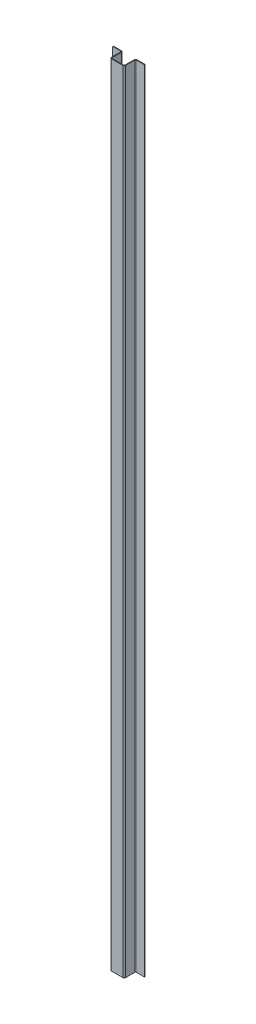
ISO-10303-21;
HEADER;
FILE_DESCRIPTION(('STEP AP214'),'2;1');
FILE_NAME('part.step','',(''),(''),'','','');
FILE_SCHEMA(('AUTOMOTIVE_DESIGN { 1 0 10303 214 1 1 1 1 }'));
ENDSEC;
DATA;
#1=APPLICATION_CONTEXT('core data for automotive mechanical design processes');
#2=APPLICATION_PROTOCOL_DEFINITION('international standard','automotive_design',2000,#1);
#3=PRODUCT_CONTEXT('',#1,'mechanical');
#4=PRODUCT('Part','Part','',(#3));
#5=PRODUCT_RELATED_PRODUCT_CATEGORY('part','',(#4));
#6=PRODUCT_DEFINITION_FORMATION('','',#4);
#7=PRODUCT_DEFINITION_CONTEXT('part definition',#1,'design');
#8=PRODUCT_DEFINITION('design','',#6,#7);
#9=PRODUCT_DEFINITION_SHAPE('','',#8);
#10=(LENGTH_UNIT() NAMED_UNIT(*) SI_UNIT(.MILLI.,.METRE.));
#11=(NAMED_UNIT(*) PLANE_ANGLE_UNIT() SI_UNIT($,.RADIAN.));
#12=(NAMED_UNIT(*) SI_UNIT($,.STERADIAN.) SOLID_ANGLE_UNIT());
#13=UNCERTAINTY_MEASURE_WITH_UNIT(LENGTH_MEASURE(1.E-05),#10,'distance_accuracy_value','');
#14=(GEOMETRIC_REPRESENTATION_CONTEXT(3) GLOBAL_UNCERTAINTY_ASSIGNED_CONTEXT((#13)) GLOBAL_UNIT_ASSIGNED_CONTEXT((#10,
#11,#12)) REPRESENTATION_CONTEXT('',''));
#15=CARTESIAN_POINT('',(0.,0.,0.));
#16=DIRECTION('',(0.,0.,1.));
#17=DIRECTION('',(1.,0.,0.));
#18=AXIS2_PLACEMENT_3D('',#15,#16,#17);
#19=CARTESIAN_POINT('',(22.5000000000011,-1254.,-38.0000000000003));
#20=DIRECTION('',(0.,1.,0.));
#21=DIRECTION('',(0.,0.,1.));
#22=AXIS2_PLACEMENT_3D('',#19,#20,#21);
#23=PLANE('',#22);
#24=DIRECTION('',(-1.,0.,0.));
#25=VECTOR('',#24,1.);
#26=CARTESIAN_POINT('',(22.4999999999993,-1254.,-33.4999999999996));
#27=LINE('',#26,#25);
#28=CARTESIAN_POINT('',(22.4999999999993,-1254.,-33.4999999999996));
#29=VERTEX_POINT('',#28);
#30=CARTESIAN_POINT('',(20.499999999999,-1254.,-33.4999999999996));
#31=VERTEX_POINT('',#30);
#32=EDGE_CURVE('E314',#29,#31,#27,.T.);
#33=ORIENTED_EDGE('',*,*,#32,.F.);
#34=DIRECTION('',(0.,0.,-1.));
#35=VECTOR('',#34,1.);
#36=CARTESIAN_POINT('',(22.5000000000001,-1254.,7.54951656745106E-12));
#37=LINE('',#36,#35);
#38=CARTESIAN_POINT('',(22.5000000000001,-1254.,-4.49999999999973));
#39=VERTEX_POINT('',#38);
#40=EDGE_CURVE('E416',#39,#29,#37,.T.);
#41=ORIENTED_EDGE('',*,*,#40,.F.);
#42=DIRECTION('',(-1.,0.,0.));
#43=VECTOR('',#42,1.);
#44=CARTESIAN_POINT('',(20.5000000000001,-1254.,-4.49999999999973));
#45=LINE('',#44,#43);
#46=CARTESIAN_POINT('',(20.5000000000001,-1254.,-4.49999999999973));
#47=VERTEX_POINT('',#46);
#48=EDGE_CURVE('E427',#47,#39,#45,.F.);
#49=ORIENTED_EDGE('',*,*,#48,.F.);
#50=DIRECTION('',(0.,0.,1.));
#51=VECTOR('',#50,1.);
#52=CARTESIAN_POINT('',(20.5000000000009,-1254.,-38.0000000000003));
#53=LINE('',#52,#51);
#54=EDGE_CURVE('E421',#47,#31,#53,.F.);
#55=ORIENTED_EDGE('',*,*,#54,.T.);
#56=EDGE_LOOP('',(#33,#41,#49,#55));
#57=FACE_BOUND('',#56,.T.);
#58=ADVANCED_FACE('F118',(#57),#23,.F.);
#59=CARTESIAN_POINT('',(22.5000000000001,1254.,-1.99999999999978));
#60=DIRECTION('',(0.,-1.,0.));
#61=DIRECTION('',(0.,0.,-1.));
#62=AXIS2_PLACEMENT_3D('',#59,#60,#61);
#63=PLANE('',#62);
#64=DIRECTION('',(-1.,0.,0.));
#65=VECTOR('',#64,1.);
#66=CARTESIAN_POINT('',(22.4999999999996,1254.,-33.4999999999996));
#67=LINE('',#66,#65);
#68=CARTESIAN_POINT('',(22.4999999999996,1254.,-33.4999999999996));
#69=VERTEX_POINT('',#68);
#70=CARTESIAN_POINT('',(20.5,1254.,-33.5000000000005));
#71=VERTEX_POINT('',#70);
#72=EDGE_CURVE('E303',#69,#71,#67,.T.);
#73=ORIENTED_EDGE('',*,*,#72,.T.);
#74=DIRECTION('',(0.,0.,-1.));
#75=VECTOR('',#74,1.);
#76=CARTESIAN_POINT('',(20.5000000000006,1254.,-1.99999999999978));
#77=LINE('',#76,#75);
#78=CARTESIAN_POINT('',(20.5000000000006,1254.,-4.49999999999928));
#79=VERTEX_POINT('',#78);
#80=EDGE_CURVE('E419',#71,#79,#77,.F.);
#81=ORIENTED_EDGE('',*,*,#80,.T.);
#82=DIRECTION('',(-1.,0.,0.));
#83=VECTOR('',#82,1.);
#84=CARTESIAN_POINT('',(22.5000000000001,1254.,-4.49999999999973));
#85=LINE('',#84,#83);
#86=CARTESIAN_POINT('',(22.5000000000001,1254.,-4.49999999999973));
#87=VERTEX_POINT('',#86);
#88=EDGE_CURVE('E410',#79,#87,#85,.F.);
#89=ORIENTED_EDGE('',*,*,#88,.T.);
#90=DIRECTION('',(0.,0.,1.));
#91=VECTOR('',#90,1.);
#92=CARTESIAN_POINT('',(22.5,1254.,-7.54951656745106E-12));
#93=LINE('',#92,#91);
#94=EDGE_CURVE('E413',#69,#87,#93,.T.);
#95=ORIENTED_EDGE('',*,*,#94,.F.);
#96=EDGE_LOOP('',(#73,#81,#89,#95));
#97=FACE_BOUND('',#96,.T.);
#98=ADVANCED_FACE('F512',(#97),#63,.F.);
#99=CARTESIAN_POINT('',(22.4999999999996,-3.33066907387547E-13,4.44089209850063E-13));
#100=DIRECTION('',(-1.,0.,0.));
#101=DIRECTION('',(0.,0.,1.));
#102=AXIS2_PLACEMENT_3D('',#99,#100,#101);
#103=PLANE('',#102);
#104=DIRECTION('',(0.,1.,0.));
#105=VECTOR('',#104,1.);
#106=CARTESIAN_POINT('',(22.4999999999996,1254.,-33.4999999999996));
#107=LINE('',#106,#105);
#108=EDGE_CURVE('E309',#69,#29,#107,.F.);
#109=ORIENTED_EDGE('',*,*,#108,.F.);
#110=ORIENTED_EDGE('',*,*,#94,.T.);
#111=DIRECTION('',(0.,-1.,0.));
#112=VECTOR('',#111,1.);
#113=CARTESIAN_POINT('',(22.5000000000001,1254.,-4.49999999999973));
#114=LINE('',#113,#112);
#115=EDGE_CURVE('E424',#39,#87,#114,.F.);
#116=ORIENTED_EDGE('',*,*,#115,.F.);
#117=ORIENTED_EDGE('',*,*,#40,.T.);
#118=EDGE_LOOP('',(#109,#110,#116,#117));
#119=FACE_BOUND('',#118,.T.);
#120=ADVANCED_FACE('F518',(#119),#103,.F.);
#121=CARTESIAN_POINT('',(20.4999999999999,-4.16333634234434E-13,-4.44089209850063E-13));
#122=DIRECTION('',(-1.,0.,0.));
#123=DIRECTION('',(0.,0.,1.));
#124=AXIS2_PLACEMENT_3D('',#121,#122,#123);
#125=PLANE('',#124);
#126=ORIENTED_EDGE('',*,*,#80,.F.);
#127=DIRECTION('',(0.,1.,0.));
#128=VECTOR('',#127,1.);
#129=CARTESIAN_POINT('',(20.5,1254.,-33.5000000000005));
#130=LINE('',#129,#128);
#131=EDGE_CURVE('E298',#71,#31,#130,.F.);
#132=ORIENTED_EDGE('',*,*,#131,.T.);
#133=ORIENTED_EDGE('',*,*,#54,.F.);
#134=DIRECTION('',(0.,-1.,0.));
#135=VECTOR('',#134,1.);
#136=CARTESIAN_POINT('',(20.5000000000006,1254.,-4.49999999999928));
#137=LINE('',#136,#135);
#138=EDGE_CURVE('E430',#79,#47,#137,.T.);
#139=ORIENTED_EDGE('',*,*,#138,.F.);
#140=EDGE_LOOP('',(#126,#132,#133,#139));
#141=FACE_BOUND('',#140,.T.);
#142=ADVANCED_FACE('F819',(#141),#125,.T.);
#143=CARTESIAN_POINT('',(-22.4999999999987,1254.,-37.9999999999985));
#144=DIRECTION('',(0.,-1.,0.));
#145=DIRECTION('',(0.,0.,-1.));
#146=AXIS2_PLACEMENT_3D('',#143,#144,#145);
#147=PLANE('',#146);
#148=DIRECTION('',(1.,0.,0.));
#149=VECTOR('',#148,1.);
#150=CARTESIAN_POINT('',(-22.5000000000006,1254.,-33.4999999999979));
#151=LINE('',#150,#149);
#152=CARTESIAN_POINT('',(-22.5000000000006,1254.,-33.4999999999979));
#153=VERTEX_POINT('',#152);
#154=CARTESIAN_POINT('',(-20.5000000000006,1254.,-33.4999999999974));
#155=VERTEX_POINT('',#154);
#156=EDGE_CURVE('E364',#153,#155,#151,.T.);
#157=ORIENTED_EDGE('',*,*,#156,.F.);
#158=DIRECTION('',(0.,0.,-1.));
#159=VECTOR('',#158,1.);
#160=CARTESIAN_POINT('',(-22.4999999999999,1254.,-5.77315972805081E-12));
#161=LINE('',#160,#159);
#162=CARTESIAN_POINT('',(-22.5000000000001,1254.,-4.49999999999839));
#163=VERTEX_POINT('',#162);
#164=EDGE_CURVE('E372',#163,#153,#161,.T.);
#165=ORIENTED_EDGE('',*,*,#164,.F.);
#166=DIRECTION('',(1.,0.,0.));
#167=VECTOR('',#166,1.);
#168=CARTESIAN_POINT('',(-20.5000000000006,1254.,-4.49999999999751));
#169=LINE('',#168,#167);
#170=CARTESIAN_POINT('',(-20.5000000000006,1254.,-4.49999999999751));
#171=VERTEX_POINT('',#170);
#172=EDGE_CURVE('E383',#171,#163,#169,.F.);
#173=ORIENTED_EDGE('',*,*,#172,.F.);
#174=DIRECTION('',(0.,0.,1.));
#175=VECTOR('',#174,1.);
#176=CARTESIAN_POINT('',(-20.499999999999,1254.,-37.9999999999976));
#177=LINE('',#176,#175);
#178=EDGE_CURVE('E377',#171,#155,#177,.F.);
#179=ORIENTED_EDGE('',*,*,#178,.T.);
#180=EDGE_LOOP('',(#157,#165,#173,#179));
#181=FACE_BOUND('',#180,.T.);
#182=ADVANCED_FACE('F492',(#181),#147,.F.);
#183=CARTESIAN_POINT('',(-22.4999999999996,-1254.,-1.99999999999978));
#184=DIRECTION('',(0.,1.,0.));
#185=DIRECTION('',(0.,0.,1.));
#186=AXIS2_PLACEMENT_3D('',#183,#184,#185);
#187=PLANE('',#186);
#188=DIRECTION('',(1.,0.,0.));
#189=VECTOR('',#188,1.);
#190=CARTESIAN_POINT('',(-22.5000000000007,-1254.,-33.4999999999996));
#191=LINE('',#190,#189);
#192=CARTESIAN_POINT('',(-22.5000000000007,-1254.,-33.4999999999996));
#193=VERTEX_POINT('',#192);
#194=CARTESIAN_POINT('',(-20.5,-1254.,-33.4999999999987));
#195=VERTEX_POINT('',#194);
#196=EDGE_CURVE('E354',#193,#195,#191,.T.);
#197=ORIENTED_EDGE('',*,*,#196,.T.);
#198=DIRECTION('',(0.,0.,-1.));
#199=VECTOR('',#198,1.);
#200=CARTESIAN_POINT('',(-20.4999999999999,-1254.,-2.00000000000022));
#201=LINE('',#200,#199);
#202=CARTESIAN_POINT('',(-20.4999999999999,-1254.,-4.50000000000017));
#203=VERTEX_POINT('',#202);
#204=EDGE_CURVE('E375',#195,#203,#201,.F.);
#205=ORIENTED_EDGE('',*,*,#204,.T.);
#206=DIRECTION('',(1.,0.,0.));
#207=VECTOR('',#206,1.);
#208=CARTESIAN_POINT('',(-22.4999999999997,-1254.,-4.49999999999973));
#209=LINE('',#208,#207);
#210=CARTESIAN_POINT('',(-22.4999999999997,-1254.,-4.49999999999973));
#211=VERTEX_POINT('',#210);
#212=EDGE_CURVE('E366',#203,#211,#209,.F.);
#213=ORIENTED_EDGE('',*,*,#212,.T.);
#214=DIRECTION('',(0.,0.,1.));
#215=VECTOR('',#214,1.);
#216=CARTESIAN_POINT('',(-22.4999999999997,-1254.,7.99360577730113E-12));
#217=LINE('',#216,#215);
#218=EDGE_CURVE('E369',#193,#211,#217,.T.);
#219=ORIENTED_EDGE('',*,*,#218,.F.);
#220=EDGE_LOOP('',(#197,#205,#213,#219));
#221=FACE_BOUND('',#220,.T.);
#222=ADVANCED_FACE('F839',(#221),#187,.F.);
#223=CARTESIAN_POINT('',(-22.5000000000002,-4.44089209850063E-13,1.33226762955019E-12));
#224=DIRECTION('',(1.,0.,0.));
#225=DIRECTION('',(0.,0.,-1.));
#226=AXIS2_PLACEMENT_3D('',#223,#224,#225);
#227=PLANE('',#226);
#228=DIRECTION('',(0.,-1.,0.));
#229=VECTOR('',#228,1.);
#230=CARTESIAN_POINT('',(-22.5000000000007,-1254.,-33.4999999999996));
#231=LINE('',#230,#229);
#232=EDGE_CURVE('E360',#193,#153,#231,.F.);
#233=ORIENTED_EDGE('',*,*,#232,.F.);
#234=ORIENTED_EDGE('',*,*,#218,.T.);
#235=DIRECTION('',(0.,1.,0.));
#236=VECTOR('',#235,1.);
#237=CARTESIAN_POINT('',(-22.4999999999997,-1254.,-4.49999999999973));
#238=LINE('',#237,#236);
#239=EDGE_CURVE('E380',#163,#211,#238,.F.);
#240=ORIENTED_EDGE('',*,*,#239,.F.);
#241=ORIENTED_EDGE('',*,*,#164,.T.);
#242=EDGE_LOOP('',(#233,#234,#240,#241));
#243=FACE_BOUND('',#242,.T.);
#244=ADVANCED_FACE('F497',(#243),#227,.F.);
#245=CARTESIAN_POINT('',(-20.5000000000001,-4.16333634234535E-13,2.22044604925031E-12));
#246=DIRECTION('',(1.,0.,0.));
#247=DIRECTION('',(0.,0.,-1.));
#248=AXIS2_PLACEMENT_3D('',#245,#246,#247);
#249=PLANE('',#248);
#250=ORIENTED_EDGE('',*,*,#204,.F.);
#251=DIRECTION('',(0.,-1.,0.));
#252=VECTOR('',#251,1.);
#253=CARTESIAN_POINT('',(-20.5,-1254.,-33.4999999999987));
#254=LINE('',#253,#252);
#255=EDGE_CURVE('E349',#195,#155,#254,.F.);
#256=ORIENTED_EDGE('',*,*,#255,.T.);
#257=ORIENTED_EDGE('',*,*,#178,.F.);
#258=DIRECTION('',(0.,1.,0.));
#259=VECTOR('',#258,1.);
#260=CARTESIAN_POINT('',(-20.4999999999999,-1254.,-4.50000000000017));
#261=LINE('',#260,#259);
#262=EDGE_CURVE('E386',#203,#171,#261,.T.);
#263=ORIENTED_EDGE('',*,*,#262,.F.);
#264=EDGE_LOOP('',(#250,#256,#257,#263));
#265=FACE_BOUND('',#264,.T.);
#266=ADVANCED_FACE('F489',(#265),#249,.T.);
#267=CARTESIAN_POINT('',(1.11022302462516E-13,-5.27355936696949E-13,-2.00000000000022));
#268=DIRECTION('',(0.,0.,1.));
#269=DIRECTION('',(1.,0.,0.));
#270=AXIS2_PLACEMENT_3D('',#267,#268,#269);
#271=PLANE('',#270);
#272=DIRECTION('',(0.,1.,0.));
#273=VECTOR('',#272,1.);
#274=CARTESIAN_POINT('',(-18.,1254.,-1.99999999999756));
#275=LINE('',#274,#273);
#276=CARTESIAN_POINT('',(-18.,1254.,-1.99999999999756));
#277=VERTEX_POINT('',#276);
#278=CARTESIAN_POINT('',(-17.9999999999998,-1254.,-2.00000000000022));
#279=VERTEX_POINT('',#278);
#280=EDGE_CURVE('E403',#277,#279,#275,.F.);
#281=ORIENTED_EDGE('',*,*,#280,.F.);
#282=DIRECTION('',(-1.,0.,0.));
#283=VECTOR('',#282,1.);
#284=CARTESIAN_POINT('',(22.5000000000001,1254.,-1.99999999999978));
#285=LINE('',#284,#283);
#286=CARTESIAN_POINT('',(18.0000000000003,1254.,-1.99999999999978));
#287=VERTEX_POINT('',#286);
#288=EDGE_CURVE('E13',#287,#277,#285,.T.);
#289=ORIENTED_EDGE('',*,*,#288,.F.);
#290=DIRECTION('',(0.,-1.,0.));
#291=VECTOR('',#290,1.);
#292=CARTESIAN_POINT('',(18.0000000000003,-1254.,-2.00000000000022));
#293=LINE('',#292,#291);
#294=CARTESIAN_POINT('',(18.0000000000003,-1254.,-2.00000000000022));
#295=VERTEX_POINT('',#294);
#296=EDGE_CURVE('E447',#295,#287,#293,.F.);
#297=ORIENTED_EDGE('',*,*,#296,.F.);
#298=DIRECTION('',(1.,0.,0.));
#299=VECTOR('',#298,1.);
#300=CARTESIAN_POINT('',(22.5000000000005,-1254.,-1.99999999999978));
#301=LINE('',#300,#299);
#302=EDGE_CURVE('E127',#279,#295,#301,.T.);
#303=ORIENTED_EDGE('',*,*,#302,.F.);
#304=EDGE_LOOP('',(#281,#289,#297,#303));
#305=FACE_BOUND('',#304,.T.);
#306=ADVANCED_FACE('F479',(#305),#271,.F.);
#307=CARTESIAN_POINT('',(0.,0.,0.));
#308=DIRECTION('',(0.,0.,1.));
#309=DIRECTION('',(1.,0.,0.));
#310=AXIS2_PLACEMENT_3D('',#307,#308,#309);
#311=PLANE('',#310);
#312=DIRECTION('',(-1.,0.,0.));
#313=VECTOR('',#312,1.);
#314=CARTESIAN_POINT('',(22.4999999999999,1254.,0.));
#315=LINE('',#314,#313);
#316=CARTESIAN_POINT('',(18.0000000000003,1254.,0.));
#317=VERTEX_POINT('',#316);
#318=CARTESIAN_POINT('',(-18.0000000000001,1254.,2.66453525910038E-12));
#319=VERTEX_POINT('',#318);
#320=EDGE_CURVE('E122',#317,#319,#315,.T.);
#321=ORIENTED_EDGE('',*,*,#320,.T.);
#322=DIRECTION('',(0.,1.,0.));
#323=VECTOR('',#322,1.);
#324=CARTESIAN_POINT('',(-18.0000000000001,1254.,2.66453525910038E-12));
#325=LINE('',#324,#323);
#326=CARTESIAN_POINT('',(-17.9999999999999,-1254.,1.33226762955019E-12));
#327=VERTEX_POINT('',#326);
#328=EDGE_CURVE('E390',#319,#327,#325,.F.);
#329=ORIENTED_EDGE('',*,*,#328,.T.);
#330=DIRECTION('',(1.,0.,0.));
#331=VECTOR('',#330,1.);
#332=CARTESIAN_POINT('',(22.5000000000001,-1254.,0.));
#333=LINE('',#332,#331);
#334=CARTESIAN_POINT('',(18.0000000000001,-1254.,0.));
#335=VERTEX_POINT('',#334);
#336=EDGE_CURVE('E454',#327,#335,#333,.T.);
#337=ORIENTED_EDGE('',*,*,#336,.T.);
#338=DIRECTION('',(0.,-1.,0.));
#339=VECTOR('',#338,1.);
#340=CARTESIAN_POINT('',(18.0000000000001,-1254.,0.));
#341=LINE('',#340,#339);
#342=EDGE_CURVE('E434',#335,#317,#341,.F.);
#343=ORIENTED_EDGE('',*,*,#342,.T.);
#344=EDGE_LOOP('',(#321,#329,#337,#343));
#345=FACE_BOUND('',#344,.T.);
#346=ADVANCED_FACE('F463',(#345),#311,.T.);
#347=CARTESIAN_POINT('',(22.5000000000001,1254.,-1.99999999999978));
#348=DIRECTION('',(0.,1.,0.));
#349=DIRECTION('',(0.,0.,1.));
#350=AXIS2_PLACEMENT_3D('',#347,#348,#349);
#351=PLANE('',#350);
#352=ORIENTED_EDGE('',*,*,#288,.T.);
#353=DIRECTION('',(0.,0.,1.));
#354=VECTOR('',#353,1.);
#355=CARTESIAN_POINT('',(-18.,1254.,-1.99999999999756));
#356=LINE('',#355,#354);
#357=EDGE_CURVE('E397',#277,#319,#356,.T.);
#358=ORIENTED_EDGE('',*,*,#357,.T.);
#359=ORIENTED_EDGE('',*,*,#320,.F.);
#360=DIRECTION('',(0.,0.,1.));
#361=VECTOR('',#360,1.);
#362=CARTESIAN_POINT('',(18.0000000000003,1254.,-1.99999999999978));
#363=LINE('',#362,#361);
#364=EDGE_CURVE('E451',#287,#317,#363,.T.);
#365=ORIENTED_EDGE('',*,*,#364,.F.);
#366=EDGE_LOOP('',(#352,#358,#359,#365));
#367=FACE_BOUND('',#366,.T.);
#368=ADVANCED_FACE('F466',(#367),#351,.T.);
#369=CARTESIAN_POINT('',(22.5000000000005,-1254.,-1.99999999999978));
#370=DIRECTION('',(0.,-1.,0.));
#371=DIRECTION('',(0.,0.,-1.));
#372=AXIS2_PLACEMENT_3D('',#369,#370,#371);
#373=PLANE('',#372);
#374=DIRECTION('',(0.,0.,1.));
#375=VECTOR('',#374,1.);
#376=CARTESIAN_POINT('',(-17.9999999999998,-1254.,-2.00000000000022));
#377=LINE('',#376,#375);
#378=EDGE_CURVE('E407',#279,#327,#377,.T.);
#379=ORIENTED_EDGE('',*,*,#378,.F.);
#380=ORIENTED_EDGE('',*,*,#302,.T.);
#381=DIRECTION('',(0.,0.,1.));
#382=VECTOR('',#381,1.);
#383=CARTESIAN_POINT('',(18.0000000000003,-1254.,-2.00000000000022));
#384=LINE('',#383,#382);
#385=EDGE_CURVE('E441',#295,#335,#384,.T.);
#386=ORIENTED_EDGE('',*,*,#385,.T.);
#387=ORIENTED_EDGE('',*,*,#336,.F.);
#388=EDGE_LOOP('',(#379,#380,#386,#387));
#389=FACE_BOUND('',#388,.T.);
#390=ADVANCED_FACE('F120',(#389),#373,.T.);
#391=CARTESIAN_POINT('',(18.0000000000003,1254.,-4.49999999999973));
#392=DIRECTION('',(0.,1.,0.));
#393=DIRECTION('',(0.,0.,1.));
#394=AXIS2_PLACEMENT_3D('',#391,#392,#393);
#395=PLANE('',#394);
#396=ORIENTED_EDGE('',*,*,#88,.F.);
#397=CARTESIAN_POINT('',(18.0000000000003,1254.,-4.49999999999973));
#398=DIRECTION('',(0.,-1.,0.));
#399=DIRECTION('',(0.,0.,-1.));
#400=AXIS2_PLACEMENT_3D('',#397,#398,#399);
#401=CIRCLE('',#400,2.5);
#402=EDGE_CURVE('E444',#287,#79,#401,.F.);
#403=ORIENTED_EDGE('',*,*,#402,.F.);
#404=ORIENTED_EDGE('',*,*,#364,.T.);
#405=CARTESIAN_POINT('',(18.0000000000003,1254.,-4.49999999999973));
#406=DIRECTION('',(0.,-1.,0.));
#407=DIRECTION('',(0.,0.,-1.));
#408=AXIS2_PLACEMENT_3D('',#405,#406,#407);
#409=CIRCLE('',#408,4.5);
#410=EDGE_CURVE('E437',#317,#87,#409,.F.);
#411=ORIENTED_EDGE('',*,*,#410,.T.);
#412=EDGE_LOOP('',(#396,#403,#404,#411));
#413=FACE_BOUND('',#412,.T.);
#414=ADVANCED_FACE('F533',(#413),#395,.T.);
#415=CARTESIAN_POINT('',(18.0000000000005,-1254.,-4.49999999999973));
#416=DIRECTION('',(0.,1.,0.));
#417=DIRECTION('',(0.,0.,1.));
#418=AXIS2_PLACEMENT_3D('',#415,#416,#417);
#419=PLANE('',#418);
#420=CARTESIAN_POINT('',(18.0000000000005,-1254.,-4.49999999999973));
#421=DIRECTION('',(0.,-1.,0.));
#422=DIRECTION('',(0.,0.,-1.));
#423=AXIS2_PLACEMENT_3D('',#420,#421,#422);
#424=CIRCLE('',#423,2.5);
#425=EDGE_CURVE('E415',#47,#295,#424,.T.);
#426=ORIENTED_EDGE('',*,*,#425,.F.);
#427=ORIENTED_EDGE('',*,*,#48,.T.);
#428=CARTESIAN_POINT('',(18.0000000000005,-1254.,-4.49999999999973));
#429=DIRECTION('',(0.,-1.,0.));
#430=DIRECTION('',(0.,0.,-1.));
#431=AXIS2_PLACEMENT_3D('',#428,#429,#430);
#432=CIRCLE('',#431,4.5);
#433=EDGE_CURVE('E438',#39,#335,#432,.T.);
#434=ORIENTED_EDGE('',*,*,#433,.T.);
#435=ORIENTED_EDGE('',*,*,#385,.F.);
#436=EDGE_LOOP('',(#426,#427,#434,#435));
#437=FACE_BOUND('',#436,.T.);
#438=ADVANCED_FACE('F528',(#437),#419,.F.);
#439=CARTESIAN_POINT('',(18.0000000000005,-1254.,-4.49999999999973));
#440=DIRECTION('',(0.,-1.,0.));
#441=DIRECTION('',(1.,0.,0.));
#442=AXIS2_PLACEMENT_3D('',#439,#440,#441);
#443=CYLINDRICAL_SURFACE('',#442,4.5);
#444=ORIENTED_EDGE('',*,*,#342,.F.);
#445=ORIENTED_EDGE('',*,*,#433,.F.);
#446=ORIENTED_EDGE('',*,*,#115,.T.);
#447=ORIENTED_EDGE('',*,*,#410,.F.);
#448=EDGE_LOOP('',(#444,#445,#446,#447));
#449=FACE_BOUND('',#448,.T.);
#450=ADVANCED_FACE('F524',(#449),#443,.T.);
#451=CARTESIAN_POINT('',(18.0000000000005,-1254.,-4.49999999999973));
#452=DIRECTION('',(0.,-1.,0.));
#453=DIRECTION('',(1.,0.,0.));
#454=AXIS2_PLACEMENT_3D('',#451,#452,#453);
#455=CYLINDRICAL_SURFACE('',#454,2.5);
#456=ORIENTED_EDGE('',*,*,#296,.T.);
#457=ORIENTED_EDGE('',*,*,#402,.T.);
#458=ORIENTED_EDGE('',*,*,#138,.T.);
#459=ORIENTED_EDGE('',*,*,#425,.T.);
#460=EDGE_LOOP('',(#456,#457,#458,#459));
#461=FACE_BOUND('',#460,.T.);
#462=ADVANCED_FACE('F527',(#461),#455,.F.);
#463=CARTESIAN_POINT('',(-18.0000000000002,-1254.,-4.50000000000017));
#464=DIRECTION('',(0.,-1.,0.));
#465=DIRECTION('',(0.,0.,-1.));
#466=AXIS2_PLACEMENT_3D('',#463,#464,#465);
#467=PLANE('',#466);
#468=ORIENTED_EDGE('',*,*,#212,.F.);
#469=CARTESIAN_POINT('',(-18.0000000000002,-1254.,-4.50000000000017));
#470=DIRECTION('',(0.,1.,0.));
#471=DIRECTION('',(0.,0.,1.));
#472=AXIS2_PLACEMENT_3D('',#469,#470,#471);
#473=CIRCLE('',#472,2.5);
#474=EDGE_CURVE('E400',#279,#203,#473,.F.);
#475=ORIENTED_EDGE('',*,*,#474,.F.);
#476=ORIENTED_EDGE('',*,*,#378,.T.);
#477=CARTESIAN_POINT('',(-18.0000000000002,-1254.,-4.50000000000017));
#478=DIRECTION('',(0.,1.,0.));
#479=DIRECTION('',(0.,0.,1.));
#480=AXIS2_PLACEMENT_3D('',#477,#478,#479);
#481=CIRCLE('',#480,4.5);
#482=EDGE_CURVE('E393',#327,#211,#481,.F.);
#483=ORIENTED_EDGE('',*,*,#482,.T.);
#484=EDGE_LOOP('',(#468,#475,#476,#483));
#485=FACE_BOUND('',#484,.T.);
#486=ADVANCED_FACE('F485',(#485),#467,.T.);
#487=CARTESIAN_POINT('',(-18.0000000000002,1254.,-4.49999999999795));
#488=DIRECTION('',(0.,-1.,0.));
#489=DIRECTION('',(0.,0.,-1.));
#490=AXIS2_PLACEMENT_3D('',#487,#488,#489);
#491=PLANE('',#490);
#492=CARTESIAN_POINT('',(-18.0000000000002,1254.,-4.49999999999795));
#493=DIRECTION('',(0.,1.,0.));
#494=DIRECTION('',(0.,0.,1.));
#495=AXIS2_PLACEMENT_3D('',#492,#493,#494);
#496=CIRCLE('',#495,2.5);
#497=EDGE_CURVE('E371',#171,#277,#496,.T.);
#498=ORIENTED_EDGE('',*,*,#497,.F.);
#499=ORIENTED_EDGE('',*,*,#172,.T.);
#500=CARTESIAN_POINT('',(-18.0000000000002,1254.,-4.49999999999795));
#501=DIRECTION('',(0.,1.,0.));
#502=DIRECTION('',(0.,0.,1.));
#503=AXIS2_PLACEMENT_3D('',#500,#501,#502);
#504=CIRCLE('',#503,4.5);
#505=EDGE_CURVE('E394',#163,#319,#504,.T.);
#506=ORIENTED_EDGE('',*,*,#505,.T.);
#507=ORIENTED_EDGE('',*,*,#357,.F.);
#508=EDGE_LOOP('',(#498,#499,#506,#507));
#509=FACE_BOUND('',#508,.T.);
#510=ADVANCED_FACE('F470',(#509),#491,.F.);
#511=CARTESIAN_POINT('',(-18.0000000000002,1254.,-4.49999999999795));
#512=DIRECTION('',(0.,1.,0.));
#513=DIRECTION('',(-1.,0.,0.));
#514=AXIS2_PLACEMENT_3D('',#511,#512,#513);
#515=CYLINDRICAL_SURFACE('',#514,4.5);
#516=ORIENTED_EDGE('',*,*,#328,.F.);
#517=ORIENTED_EDGE('',*,*,#505,.F.);
#518=ORIENTED_EDGE('',*,*,#239,.T.);
#519=ORIENTED_EDGE('',*,*,#482,.F.);
#520=EDGE_LOOP('',(#516,#517,#518,#519));
#521=FACE_BOUND('',#520,.T.);
#522=ADVANCED_FACE('F500',(#521),#515,.T.);
#523=CARTESIAN_POINT('',(-18.0000000000002,1254.,-4.49999999999795));
#524=DIRECTION('',(0.,1.,0.));
#525=DIRECTION('',(-1.,0.,0.));
#526=AXIS2_PLACEMENT_3D('',#523,#524,#525);
#527=CYLINDRICAL_SURFACE('',#526,2.5);
#528=ORIENTED_EDGE('',*,*,#280,.T.);
#529=ORIENTED_EDGE('',*,*,#474,.T.);
#530=ORIENTED_EDGE('',*,*,#262,.T.);
#531=ORIENTED_EDGE('',*,*,#497,.T.);
#532=EDGE_LOOP('',(#528,#529,#530,#531));
#533=FACE_BOUND('',#532,.T.);
#534=ADVANCED_FACE('F474',(#533),#527,.F.);
#535=CARTESIAN_POINT('',(-25.0000000000006,1254.,-33.4999999999974));
#536=DIRECTION('',(0.,1.,0.));
#537=DIRECTION('',(0.,0.,1.));
#538=AXIS2_PLACEMENT_3D('',#535,#536,#537);
#539=PLANE('',#538);
#540=DIRECTION('',(0.,0.,1.));
#541=VECTOR('',#540,1.);
#542=CARTESIAN_POINT('',(-24.9999999999992,1254.,-37.999999999998));
#543=LINE('',#542,#541);
#544=CARTESIAN_POINT('',(-25.0000000000005,1254.,-35.9999999999974));
#545=VERTEX_POINT('',#544);
#546=CARTESIAN_POINT('',(-24.9999999999992,1254.,-37.999999999998));
#547=VERTEX_POINT('',#546);
#548=EDGE_CURVE('E316',#545,#547,#543,.F.);
#549=ORIENTED_EDGE('',*,*,#548,.F.);
#550=CARTESIAN_POINT('',(-25.0000000000006,1254.,-33.4999999999974));
#551=DIRECTION('',(0.,-1.,0.));
#552=DIRECTION('',(0.,0.,-1.));
#553=AXIS2_PLACEMENT_3D('',#550,#551,#552);
#554=CIRCLE('',#553,2.50000000000001);
#555=EDGE_CURVE('E357',#153,#545,#554,.F.);
#556=ORIENTED_EDGE('',*,*,#555,.F.);
#557=ORIENTED_EDGE('',*,*,#156,.T.);
#558=CARTESIAN_POINT('',(-25.0000000000006,1254.,-33.4999999999974));
#559=DIRECTION('',(0.,-1.,0.));
#560=DIRECTION('',(0.,0.,-1.));
#561=AXIS2_PLACEMENT_3D('',#558,#559,#560);
#562=CIRCLE('',#561,4.50000000000001);
#563=EDGE_CURVE('E143',#155,#547,#562,.F.);
#564=ORIENTED_EDGE('',*,*,#563,.T.);
#565=EDGE_LOOP('',(#549,#556,#557,#564));
#566=FACE_BOUND('',#565,.T.);
#567=ADVANCED_FACE('F507',(#566),#539,.T.);
#568=CARTESIAN_POINT('',(-25.0000000000005,-1254.,-33.5000000000001));
#569=DIRECTION('',(0.,1.,0.));
#570=DIRECTION('',(0.,0.,1.));
#571=AXIS2_PLACEMENT_3D('',#568,#569,#570);
#572=PLANE('',#571);
#573=CARTESIAN_POINT('',(-25.0000000000005,-1254.,-33.5000000000001));
#574=DIRECTION('',(0.,-1.,0.));
#575=DIRECTION('',(0.,0.,-1.));
#576=AXIS2_PLACEMENT_3D('',#573,#574,#575);
#577=CIRCLE('',#576,2.50000000000001);
#578=CARTESIAN_POINT('',(-25.0000000000006,-1254.,-36.));
#579=VERTEX_POINT('',#578);
#580=EDGE_CURVE('E322',#579,#193,#577,.T.);
#581=ORIENTED_EDGE('',*,*,#580,.F.);
#582=DIRECTION('',(0.,0.,1.));
#583=VECTOR('',#582,1.);
#584=CARTESIAN_POINT('',(-25.0000000000006,-1254.,-36.));
#585=LINE('',#584,#583);
#586=CARTESIAN_POINT('',(-24.9999999999995,-1254.,-38.0000000000003));
#587=VERTEX_POINT('',#586);
#588=EDGE_CURVE('E342',#579,#587,#585,.F.);
#589=ORIENTED_EDGE('',*,*,#588,.T.);
#590=CARTESIAN_POINT('',(-25.0000000000005,-1254.,-33.5000000000001));
#591=DIRECTION('',(0.,-1.,0.));
#592=DIRECTION('',(0.,0.,-1.));
#593=AXIS2_PLACEMENT_3D('',#590,#591,#592);
#594=CIRCLE('',#593,4.50000000000001);
#595=EDGE_CURVE('E352',#587,#195,#594,.T.);
#596=ORIENTED_EDGE('',*,*,#595,.T.);
#597=ORIENTED_EDGE('',*,*,#196,.F.);
#598=EDGE_LOOP('',(#581,#589,#596,#597));
#599=FACE_BOUND('',#598,.T.);
#600=ADVANCED_FACE('F598',(#599),#572,.F.);
#601=CARTESIAN_POINT('',(-25.0000000000005,-1254.,-33.5000000000001));
#602=DIRECTION('',(0.,-1.,0.));
#603=DIRECTION('',(0.,0.,-1.));
#604=AXIS2_PLACEMENT_3D('',#601,#602,#603);
#605=CYLINDRICAL_SURFACE('',#604,4.50000000000001);
#606=ORIENTED_EDGE('',*,*,#255,.F.);
#607=ORIENTED_EDGE('',*,*,#595,.F.);
#608=DIRECTION('',(0.,-1.,0.));
#609=VECTOR('',#608,1.);
#610=CARTESIAN_POINT('',(-24.9999999999992,1254.,-37.999999999998));
#611=LINE('',#610,#609);
#612=EDGE_CURVE('E340',#587,#547,#611,.F.);
#613=ORIENTED_EDGE('',*,*,#612,.T.);
#614=ORIENTED_EDGE('',*,*,#563,.F.);
#615=EDGE_LOOP('',(#606,#607,#613,#614));
#616=FACE_BOUND('',#615,.T.);
#617=ADVANCED_FACE('F610',(#616),#605,.T.);
#618=CARTESIAN_POINT('',(-25.0000000000005,-1254.,-33.5000000000001));
#619=DIRECTION('',(0.,-1.,0.));
#620=DIRECTION('',(0.,0.,-1.));
#621=AXIS2_PLACEMENT_3D('',#618,#619,#620);
#622=CYLINDRICAL_SURFACE('',#621,2.50000000000001);
#623=ORIENTED_EDGE('',*,*,#232,.T.);
#624=ORIENTED_EDGE('',*,*,#555,.T.);
#625=DIRECTION('',(0.,-1.,0.));
#626=VECTOR('',#625,1.);
#627=CARTESIAN_POINT('',(-25.0000000000005,1254.,-35.9999999999974));
#628=LINE('',#627,#626);
#629=EDGE_CURVE('E345',#545,#579,#628,.T.);
#630=ORIENTED_EDGE('',*,*,#629,.T.);
#631=ORIENTED_EDGE('',*,*,#580,.T.);
#632=EDGE_LOOP('',(#623,#624,#630,#631));
#633=FACE_BOUND('',#632,.T.);
#634=ADVANCED_FACE('F621',(#633),#622,.F.);
#635=CARTESIAN_POINT('',(-50.4999999999994,-1254.,-37.9999999999998));
#636=DIRECTION('',(0.,1.,0.));
#637=DIRECTION('',(0.,0.,1.));
#638=AXIS2_PLACEMENT_3D('',#635,#636,#637);
#639=PLANE('',#638);
#640=ORIENTED_EDGE('',*,*,#588,.F.);
#641=DIRECTION('',(1.,0.,0.));
#642=VECTOR('',#641,1.);
#643=CARTESIAN_POINT('',(-50.5000000000003,-1254.,-36.0000000000005));
#644=LINE('',#643,#642);
#645=CARTESIAN_POINT('',(-50.5000000000003,-1254.,-36.0000000000005));
#646=VERTEX_POINT('',#645);
#647=EDGE_CURVE('E338',#579,#646,#644,.F.);
#648=ORIENTED_EDGE('',*,*,#647,.T.);
#649=DIRECTION('',(0.,0.,1.));
#650=VECTOR('',#649,1.);
#651=CARTESIAN_POINT('',(-50.4999999999994,-1254.,-37.9999999999998));
#652=LINE('',#651,#650);
#653=CARTESIAN_POINT('',(-50.4999999999994,-1254.,-37.9999999999998));
#654=VERTEX_POINT('',#653);
#655=EDGE_CURVE('E319',#654,#646,#652,.T.);
#656=ORIENTED_EDGE('',*,*,#655,.F.);
#657=DIRECTION('',(-1.,0.,0.));
#658=VECTOR('',#657,1.);
#659=CARTESIAN_POINT('',(5.55111512312578E-13,-1254.,-38.0000000000007));
#660=LINE('',#659,#658);
#661=EDGE_CURVE('E331',#587,#654,#660,.T.);
#662=ORIENTED_EDGE('',*,*,#661,.F.);
#663=EDGE_LOOP('',(#640,#648,#656,#662));
#664=FACE_BOUND('',#663,.T.);
#665=ADVANCED_FACE('F631',(#664),#639,.F.);
#666=CARTESIAN_POINT('',(-22.4999999999987,1254.,-37.9999999999985));
#667=DIRECTION('',(0.,-1.,0.));
#668=DIRECTION('',(0.,0.,-1.));
#669=AXIS2_PLACEMENT_3D('',#666,#667,#668);
#670=PLANE('',#669);
#671=ORIENTED_EDGE('',*,*,#548,.T.);
#672=DIRECTION('',(1.,0.,0.));
#673=VECTOR('',#672,1.);
#674=CARTESIAN_POINT('',(7.7715611723761E-13,1254.,-37.9999999999998));
#675=LINE('',#674,#673);
#676=CARTESIAN_POINT('',(-50.4999999999999,1254.,-38.0000000000003));
#677=VERTEX_POINT('',#676);
#678=EDGE_CURVE('E326',#677,#547,#675,.T.);
#679=ORIENTED_EDGE('',*,*,#678,.F.);
#680=DIRECTION('',(0.,0.,1.));
#681=VECTOR('',#680,1.);
#682=CARTESIAN_POINT('',(-50.4999999999999,1254.,-38.0000000000003));
#683=LINE('',#682,#681);
#684=CARTESIAN_POINT('',(-50.5000000000002,1254.,-36.));
#685=VERTEX_POINT('',#684);
#686=EDGE_CURVE('E323',#677,#685,#683,.T.);
#687=ORIENTED_EDGE('',*,*,#686,.T.);
#688=DIRECTION('',(-1.,0.,0.));
#689=VECTOR('',#688,1.);
#690=CARTESIAN_POINT('',(-22.5000000000003,1254.,-35.9999999999978));
#691=LINE('',#690,#689);
#692=EDGE_CURVE('E333',#685,#545,#691,.F.);
#693=ORIENTED_EDGE('',*,*,#692,.T.);
#694=EDGE_LOOP('',(#671,#679,#687,#693));
#695=FACE_BOUND('',#694,.T.);
#696=ADVANCED_FACE('F642',(#695),#670,.F.);
#697=CARTESIAN_POINT('',(2.22044604925031E-13,-1.11022302462516E-13,-37.9999999999998));
#698=DIRECTION('',(0.,0.,1.));
#699=DIRECTION('',(1.,0.,0.));
#700=AXIS2_PLACEMENT_3D('',#697,#698,#699);
#701=PLANE('',#700);
#702=ORIENTED_EDGE('',*,*,#612,.F.);
#703=ORIENTED_EDGE('',*,*,#661,.T.);
#704=DIRECTION('',(0.,1.,0.));
#705=VECTOR('',#704,1.);
#706=CARTESIAN_POINT('',(-50.4999999999997,-5.27355936696949E-13,-37.9999999999998));
#707=LINE('',#706,#705);
#708=EDGE_CURVE('E329',#654,#677,#707,.T.);
#709=ORIENTED_EDGE('',*,*,#708,.T.);
#710=ORIENTED_EDGE('',*,*,#678,.T.);
#711=EDGE_LOOP('',(#702,#703,#709,#710));
#712=FACE_BOUND('',#711,.T.);
#713=ADVANCED_FACE('F653',(#712),#701,.F.);
#714=CARTESIAN_POINT('',(1.11022302462516E-13,0.,-36.));
#715=DIRECTION('',(0.,0.,1.));
#716=DIRECTION('',(1.,0.,0.));
#717=AXIS2_PLACEMENT_3D('',#714,#715,#716);
#718=PLANE('',#717);
#719=ORIENTED_EDGE('',*,*,#647,.F.);
#720=ORIENTED_EDGE('',*,*,#629,.F.);
#721=ORIENTED_EDGE('',*,*,#692,.F.);
#722=DIRECTION('',(0.,-1.,0.));
#723=VECTOR('',#722,1.);
#724=CARTESIAN_POINT('',(-50.5000000000002,1254.,-36.));
#725=LINE('',#724,#723);
#726=EDGE_CURVE('E336',#646,#685,#725,.F.);
#727=ORIENTED_EDGE('',*,*,#726,.F.);
#728=EDGE_LOOP('',(#719,#720,#721,#727));
#729=FACE_BOUND('',#728,.T.);
#730=ADVANCED_FACE('F664',(#729),#718,.T.);
#731=CARTESIAN_POINT('',(-50.4999999999999,1254.,-38.0000000000003));
#732=DIRECTION('',(1.,0.,0.));
#733=DIRECTION('',(0.,0.,-1.));
#734=AXIS2_PLACEMENT_3D('',#731,#732,#733);
#735=PLANE('',#734);
#736=ORIENTED_EDGE('',*,*,#726,.T.);
#737=ORIENTED_EDGE('',*,*,#686,.F.);
#738=ORIENTED_EDGE('',*,*,#708,.F.);
#739=ORIENTED_EDGE('',*,*,#655,.T.);
#740=EDGE_LOOP('',(#736,#737,#738,#739));
#741=FACE_BOUND('',#740,.T.);
#742=ADVANCED_FACE('F675',(#741),#735,.F.);
#743=CARTESIAN_POINT('',(24.9999999999995,-1254.,-33.4999999999996));
#744=DIRECTION('',(0.,-1.,0.));
#745=DIRECTION('',(0.,0.,-1.));
#746=AXIS2_PLACEMENT_3D('',#743,#744,#745);
#747=PLANE('',#746);
#748=DIRECTION('',(0.,0.,1.));
#749=VECTOR('',#748,1.);
#750=CARTESIAN_POINT('',(25.0000000000005,-1254.,-38.0000000000007));
#751=LINE('',#750,#749);
#752=CARTESIAN_POINT('',(25.,-1254.,-36.));
#753=VERTEX_POINT('',#752);
#754=CARTESIAN_POINT('',(25.0000000000005,-1254.,-38.0000000000007));
#755=VERTEX_POINT('',#754);
#756=EDGE_CURVE('E281',#753,#755,#751,.F.);
#757=ORIENTED_EDGE('',*,*,#756,.F.);
#758=CARTESIAN_POINT('',(24.9999999999995,-1254.,-33.4999999999996));
#759=DIRECTION('',(0.,1.,0.));
#760=DIRECTION('',(0.,0.,1.));
#761=AXIS2_PLACEMENT_3D('',#758,#759,#760);
#762=CIRCLE('',#761,2.50000000000001);
#763=EDGE_CURVE('E306',#29,#753,#762,.F.);
#764=ORIENTED_EDGE('',*,*,#763,.F.);
#765=ORIENTED_EDGE('',*,*,#32,.T.);
#766=CARTESIAN_POINT('',(24.9999999999995,-1254.,-33.4999999999996));
#767=DIRECTION('',(0.,1.,0.));
#768=DIRECTION('',(0.,0.,1.));
#769=AXIS2_PLACEMENT_3D('',#766,#767,#768);
#770=CIRCLE('',#769,4.50000000000001);
#771=EDGE_CURVE('E135',#31,#755,#770,.F.);
#772=ORIENTED_EDGE('',*,*,#771,.T.);
#773=EDGE_LOOP('',(#757,#764,#765,#772));
#774=FACE_BOUND('',#773,.T.);
#775=ADVANCED_FACE('F686',(#774),#747,.T.);
#776=CARTESIAN_POINT('',(24.9999999999997,1254.,-33.4999999999996));
#777=DIRECTION('',(0.,-1.,0.));
#778=DIRECTION('',(0.,0.,-1.));
#779=AXIS2_PLACEMENT_3D('',#776,#777,#778);
#780=PLANE('',#779);
#781=CARTESIAN_POINT('',(24.9999999999997,1254.,-33.4999999999996));
#782=DIRECTION('',(0.,1.,0.));
#783=DIRECTION('',(0.,0.,1.));
#784=AXIS2_PLACEMENT_3D('',#781,#782,#783);
#785=CIRCLE('',#784,2.50000000000001);
#786=CARTESIAN_POINT('',(25.,1254.,-35.9999999999996));
#787=VERTEX_POINT('',#786);
#788=EDGE_CURVE('E311',#787,#69,#785,.T.);
#789=ORIENTED_EDGE('',*,*,#788,.F.);
#790=DIRECTION('',(0.,0.,1.));
#791=VECTOR('',#790,1.);
#792=CARTESIAN_POINT('',(25.,1254.,-35.9999999999996));
#793=LINE('',#792,#791);
#794=CARTESIAN_POINT('',(25.0000000000011,1254.,-38.0000000000003));
#795=VERTEX_POINT('',#794);
#796=EDGE_CURVE('E292',#787,#795,#793,.F.);
#797=ORIENTED_EDGE('',*,*,#796,.T.);
#798=CARTESIAN_POINT('',(24.9999999999997,1254.,-33.4999999999996));
#799=DIRECTION('',(0.,1.,0.));
#800=DIRECTION('',(0.,0.,1.));
#801=AXIS2_PLACEMENT_3D('',#798,#799,#800);
#802=CIRCLE('',#801,4.50000000000001);
#803=EDGE_CURVE('E301',#795,#71,#802,.T.);
#804=ORIENTED_EDGE('',*,*,#803,.T.);
#805=ORIENTED_EDGE('',*,*,#72,.F.);
#806=EDGE_LOOP('',(#789,#797,#804,#805));
#807=FACE_BOUND('',#806,.T.);
#808=ADVANCED_FACE('F697',(#807),#780,.F.);
#809=CARTESIAN_POINT('',(24.9999999999997,1254.,-33.4999999999996));
#810=DIRECTION('',(0.,1.,0.));
#811=DIRECTION('',(0.,0.,-1.));
#812=AXIS2_PLACEMENT_3D('',#809,#810,#811);
#813=CYLINDRICAL_SURFACE('',#812,4.50000000000001);
#814=ORIENTED_EDGE('',*,*,#131,.F.);
#815=ORIENTED_EDGE('',*,*,#803,.F.);
#816=DIRECTION('',(0.,1.,0.));
#817=VECTOR('',#816,1.);
#818=CARTESIAN_POINT('',(25.0000000000005,-1254.,-38.0000000000007));
#819=LINE('',#818,#817);
#820=EDGE_CURVE('E290',#795,#755,#819,.F.);
#821=ORIENTED_EDGE('',*,*,#820,.T.);
#822=ORIENTED_EDGE('',*,*,#771,.F.);
#823=EDGE_LOOP('',(#814,#815,#821,#822));
#824=FACE_BOUND('',#823,.T.);
#825=ADVANCED_FACE('F708',(#824),#813,.T.);
#826=CARTESIAN_POINT('',(24.9999999999997,1254.,-33.4999999999996));
#827=DIRECTION('',(0.,1.,0.));
#828=DIRECTION('',(0.,0.,-1.));
#829=AXIS2_PLACEMENT_3D('',#826,#827,#828);
#830=CYLINDRICAL_SURFACE('',#829,2.50000000000001);
#831=ORIENTED_EDGE('',*,*,#108,.T.);
#832=ORIENTED_EDGE('',*,*,#763,.T.);
#833=DIRECTION('',(0.,1.,0.));
#834=VECTOR('',#833,1.);
#835=CARTESIAN_POINT('',(25.,-1254.,-36.));
#836=LINE('',#835,#834);
#837=EDGE_CURVE('E295',#753,#787,#836,.T.);
#838=ORIENTED_EDGE('',*,*,#837,.T.);
#839=ORIENTED_EDGE('',*,*,#788,.T.);
#840=EDGE_LOOP('',(#831,#832,#838,#839));
#841=FACE_BOUND('',#840,.T.);
#842=ADVANCED_FACE('F719',(#841),#830,.F.);
#843=CARTESIAN_POINT('',(22.5000000000011,-1254.,-38.0000000000003));
#844=DIRECTION('',(0.,1.,0.));
#845=DIRECTION('',(0.,0.,1.));
#846=AXIS2_PLACEMENT_3D('',#843,#844,#845);
#847=PLANE('',#846);
#848=ORIENTED_EDGE('',*,*,#756,.T.);
#849=DIRECTION('',(-1.,0.,0.));
#850=VECTOR('',#849,1.);
#851=CARTESIAN_POINT('',(5.55111512312578E-13,-1254.,-38.0000000000007));
#852=LINE('',#851,#850);
#853=CARTESIAN_POINT('',(50.5000000000008,-1254.,-38.0000000000003));
#854=VERTEX_POINT('',#853);
#855=EDGE_CURVE('E262',#854,#755,#852,.T.);
#856=ORIENTED_EDGE('',*,*,#855,.F.);
#857=DIRECTION('',(0.,0.,1.));
#858=VECTOR('',#857,1.);
#859=CARTESIAN_POINT('',(50.5000000000008,-1254.,-38.0000000000003));
#860=LINE('',#859,#858);
#861=CARTESIAN_POINT('',(50.4999999999999,-1254.,-36.));
#862=VERTEX_POINT('',#861);
#863=EDGE_CURVE('E268',#854,#862,#860,.T.);
#864=ORIENTED_EDGE('',*,*,#863,.T.);
#865=DIRECTION('',(1.,0.,0.));
#866=VECTOR('',#865,1.);
#867=CARTESIAN_POINT('',(22.499999999999,-1254.,-36.));
#868=LINE('',#867,#866);
#869=EDGE_CURVE('E288',#862,#753,#868,.F.);
#870=ORIENTED_EDGE('',*,*,#869,.T.);
#871=EDGE_LOOP('',(#848,#856,#864,#870));
#872=FACE_BOUND('',#871,.T.);
#873=ADVANCED_FACE('F280',(#872),#847,.F.);
#874=CARTESIAN_POINT('',(50.5000000000012,1254.,-37.999999999998));
#875=DIRECTION('',(0.,-1.,0.));
#876=DIRECTION('',(0.,0.,-1.));
#877=AXIS2_PLACEMENT_3D('',#874,#875,#876);
#878=PLANE('',#877);
#879=ORIENTED_EDGE('',*,*,#796,.F.);
#880=DIRECTION('',(-1.,0.,0.));
#881=VECTOR('',#880,1.);
#882=CARTESIAN_POINT('',(50.4999999999997,1254.,-35.9999999999978));
#883=LINE('',#882,#881);
#884=CARTESIAN_POINT('',(50.4999999999997,1254.,-35.9999999999978));
#885=VERTEX_POINT('',#884);
#886=EDGE_CURVE('E284',#787,#885,#883,.F.);
#887=ORIENTED_EDGE('',*,*,#886,.T.);
#888=DIRECTION('',(0.,0.,1.));
#889=VECTOR('',#888,1.);
#890=CARTESIAN_POINT('',(50.5000000000012,1254.,-37.999999999998));
#891=LINE('',#890,#889);
#892=CARTESIAN_POINT('',(50.5000000000012,1254.,-37.999999999998));
#893=VERTEX_POINT('',#892);
#894=EDGE_CURVE('E277',#893,#885,#891,.T.);
#895=ORIENTED_EDGE('',*,*,#894,.F.);
#896=DIRECTION('',(1.,0.,0.));
#897=VECTOR('',#896,1.);
#898=CARTESIAN_POINT('',(7.7715611723761E-13,1254.,-37.9999999999998));
#899=LINE('',#898,#897);
#900=EDGE_CURVE('E264',#795,#893,#899,.T.);
#901=ORIENTED_EDGE('',*,*,#900,.F.);
#902=EDGE_LOOP('',(#879,#887,#895,#901));
#903=FACE_BOUND('',#902,.T.);
#904=ADVANCED_FACE('F739',(#903),#878,.F.);
#905=CARTESIAN_POINT('',(2.22044604925031E-13,-1.11022302462516E-13,-37.9999999999998));
#906=DIRECTION('',(0.,0.,1.));
#907=DIRECTION('',(1.,0.,0.));
#908=AXIS2_PLACEMENT_3D('',#905,#906,#907);
#909=PLANE('',#908);
#910=ORIENTED_EDGE('',*,*,#820,.F.);
#911=ORIENTED_EDGE('',*,*,#900,.T.);
#912=DIRECTION('',(0.,-1.,0.));
#913=VECTOR('',#912,1.);
#914=CARTESIAN_POINT('',(50.5000000000004,-2.77555756156289E-13,-37.9999999999989));
#915=LINE('',#914,#913);
#916=EDGE_CURVE('E257',#893,#854,#915,.T.);
#917=ORIENTED_EDGE('',*,*,#916,.T.);
#918=ORIENTED_EDGE('',*,*,#855,.T.);
#919=EDGE_LOOP('',(#910,#911,#917,#918));
#920=FACE_BOUND('',#919,.T.);
#921=ADVANCED_FACE('F260',(#920),#909,.F.);
#922=CARTESIAN_POINT('',(1.11022302462516E-13,0.,-36.));
#923=DIRECTION('',(0.,0.,1.));
#924=DIRECTION('',(1.,0.,0.));
#925=AXIS2_PLACEMENT_3D('',#922,#923,#924);
#926=PLANE('',#925);
#927=ORIENTED_EDGE('',*,*,#886,.F.);
#928=ORIENTED_EDGE('',*,*,#837,.F.);
#929=ORIENTED_EDGE('',*,*,#869,.F.);
#930=DIRECTION('',(0.,1.,0.));
#931=VECTOR('',#930,1.);
#932=CARTESIAN_POINT('',(50.4999999999999,-1254.,-36.));
#933=LINE('',#932,#931);
#934=EDGE_CURVE('E273',#885,#862,#933,.F.);
#935=ORIENTED_EDGE('',*,*,#934,.F.);
#936=EDGE_LOOP('',(#927,#928,#929,#935));
#937=FACE_BOUND('',#936,.T.);
#938=ADVANCED_FACE('F759',(#937),#926,.T.);
#939=CARTESIAN_POINT('',(50.5000000000008,-1254.,-38.0000000000003));
#940=DIRECTION('',(-1.,0.,0.));
#941=DIRECTION('',(0.,0.,1.));
#942=AXIS2_PLACEMENT_3D('',#939,#940,#941);
#943=PLANE('',#942);
#944=ORIENTED_EDGE('',*,*,#934,.T.);
#945=ORIENTED_EDGE('',*,*,#863,.F.);
#946=ORIENTED_EDGE('',*,*,#916,.F.);
#947=ORIENTED_EDGE('',*,*,#894,.T.);
#948=EDGE_LOOP('',(#944,#945,#946,#947));
#949=FACE_BOUND('',#948,.T.);
#950=ADVANCED_FACE('F271',(#949),#943,.F.);
#951=CLOSED_SHELL('',(#58,#98,#120,#142,#182,#222,#244,#266,#306,#346,#368,#390,#414,#438,#450,
#462,#486,#510,#522,#534,#567,#600,#617,#634,#665,#696,#713,#730,#742,#775,#808,#825,#842,#873,
#904,#921,#938,#950));
#952=MANIFOLD_SOLID_BREP('B2',#951);
#953=ADVANCED_BREP_SHAPE_REPRESENTATION('',(#18,#952),#14);
#954=SHAPE_DEFINITION_REPRESENTATION(#9,#953);
ENDSEC;
END-ISO-10303-21;
